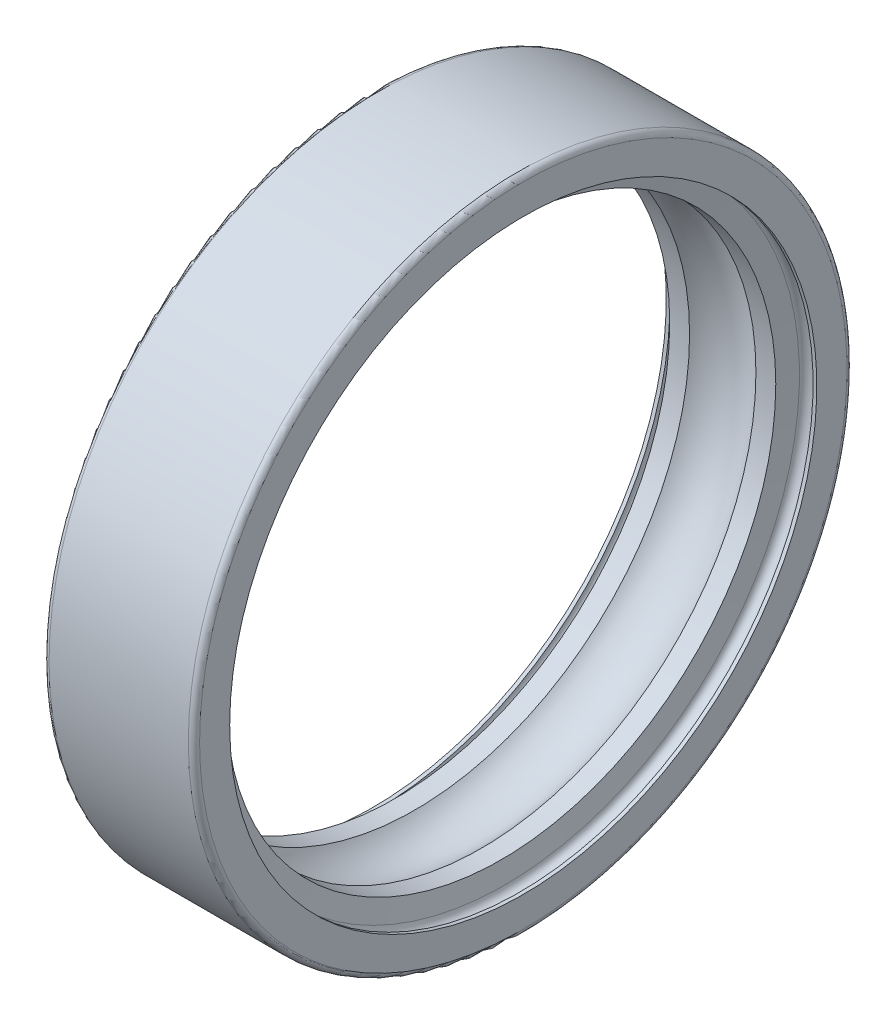
ISO-10303-21;
HEADER;
FILE_DESCRIPTION(('STEP AP214'),'2;1');
FILE_NAME('part.step','',(''),(''),'','','');
FILE_SCHEMA(('AUTOMOTIVE_DESIGN { 1 0 10303 214 1 1 1 1 }'));
ENDSEC;
DATA;
#1=APPLICATION_CONTEXT('core data for automotive mechanical design processes');
#2=APPLICATION_PROTOCOL_DEFINITION('international standard','automotive_design',2000,#1);
#3=PRODUCT_CONTEXT('',#1,'mechanical');
#4=PRODUCT('Part','Part','',(#3));
#5=PRODUCT_RELATED_PRODUCT_CATEGORY('part','',(#4));
#6=PRODUCT_DEFINITION_FORMATION('','',#4);
#7=PRODUCT_DEFINITION_CONTEXT('part definition',#1,'design');
#8=PRODUCT_DEFINITION('design','',#6,#7);
#9=PRODUCT_DEFINITION_SHAPE('','',#8);
#10=(LENGTH_UNIT() NAMED_UNIT(*) SI_UNIT(.MILLI.,.METRE.));
#11=(NAMED_UNIT(*) PLANE_ANGLE_UNIT() SI_UNIT($,.RADIAN.));
#12=(NAMED_UNIT(*) SI_UNIT($,.STERADIAN.) SOLID_ANGLE_UNIT());
#13=UNCERTAINTY_MEASURE_WITH_UNIT(LENGTH_MEASURE(1.E-05),#10,'distance_accuracy_value','');
#14=(GEOMETRIC_REPRESENTATION_CONTEXT(3) GLOBAL_UNCERTAINTY_ASSIGNED_CONTEXT((#13)) GLOBAL_UNIT_ASSIGNED_CONTEXT((#10,
#11,#12)) REPRESENTATION_CONTEXT('',''));
#15=CARTESIAN_POINT('',(0.,0.,0.));
#16=DIRECTION('',(0.,0.,1.));
#17=DIRECTION('',(1.,0.,0.));
#18=AXIS2_PLACEMENT_3D('',#15,#16,#17);
#19=CARTESIAN_POINT('',(6.81750237453724,0.,0.));
#20=DIRECTION('',(1.,0.,0.));
#21=DIRECTION('',(0.,0.,-1.));
#22=AXIS2_PLACEMENT_3D('',#19,#20,#21);
#23=CONICAL_SURFACE('',#22,14.6,1.39626340159546);
#24=CARTESIAN_POINT('',(7.00607689879512,0.,0.));
#25=DIRECTION('',(-1.,0.,0.));
#26=DIRECTION('',(0.,0.,1.));
#27=AXIS2_PLACEMENT_3D('',#24,#25,#26);
#28=CIRCLE('',#27,15.6694592710668);
#29=CARTESIAN_POINT('',(7.00607689879512,0.,15.6694592710668));
#30=VERTEX_POINT('',#29);
#31=EDGE_CURVE('E10',#30,#30,#28,.T.);
#32=ORIENTED_EDGE('',*,*,#31,.F.);
#33=EDGE_LOOP('',(#32));
#34=FACE_BOUND('',#33,.T.);
#35=CARTESIAN_POINT('',(6.81750237453724,0.,0.));
#36=DIRECTION('',(-1.,0.,0.));
#37=DIRECTION('',(0.,0.,1.));
#38=AXIS2_PLACEMENT_3D('',#35,#36,#37);
#39=CIRCLE('',#38,14.6);
#40=CARTESIAN_POINT('',(6.81750237453724,0.,14.6));
#41=VERTEX_POINT('',#40);
#42=EDGE_CURVE('E80',#41,#41,#39,.T.);
#43=ORIENTED_EDGE('',*,*,#42,.T.);
#44=EDGE_LOOP('',(#43));
#45=FACE_BOUND('',#44,.T.);
#46=ADVANCED_FACE('F14',(#34,#45),#23,.F.);
#47=CARTESIAN_POINT('',(7.4,0.,0.));
#48=DIRECTION('',(-1.,0.,0.));
#49=DIRECTION('',(0.,0.,1.));
#50=AXIS2_PLACEMENT_3D('',#47,#48,#49);
#51=TOROIDAL_SURFACE('',#50,15.6,0.4);
#52=ORIENTED_EDGE('',*,*,#31,.T.);
#53=EDGE_LOOP('',(#52));
#54=FACE_BOUND('',#53,.T.);
#55=CARTESIAN_POINT('',(7.8,0.,0.));
#56=DIRECTION('',(-1.,0.,0.));
#57=DIRECTION('',(0.,0.,1.));
#58=AXIS2_PLACEMENT_3D('',#55,#56,#57);
#59=CIRCLE('',#58,15.6);
#60=CARTESIAN_POINT('',(7.8,0.,15.6));
#61=VERTEX_POINT('',#60);
#62=EDGE_CURVE('E21',#61,#61,#59,.T.);
#63=ORIENTED_EDGE('',*,*,#62,.F.);
#64=EDGE_LOOP('',(#63));
#65=FACE_BOUND('',#64,.T.);
#66=ADVANCED_FACE('F105',(#54,#65),#51,.F.);
#67=CARTESIAN_POINT('',(0.,0.,0.));
#68=DIRECTION('',(-1.,0.,0.));
#69=DIRECTION('',(0.,0.,1.));
#70=AXIS2_PLACEMENT_3D('',#67,#68,#69);
#71=CYLINDRICAL_SURFACE('',#70,15.6);
#72=ORIENTED_EDGE('',*,*,#62,.T.);
#73=EDGE_LOOP('',(#72));
#74=FACE_BOUND('',#73,.T.);
#75=CARTESIAN_POINT('',(8.,0.,0.));
#76=DIRECTION('',(-1.,0.,0.));
#77=DIRECTION('',(0.,0.,1.));
#78=AXIS2_PLACEMENT_3D('',#75,#76,#77);
#79=CIRCLE('',#78,15.6);
#80=CARTESIAN_POINT('',(8.,0.,15.6));
#81=VERTEX_POINT('',#80);
#82=EDGE_CURVE('E30',#81,#81,#79,.T.);
#83=ORIENTED_EDGE('',*,*,#82,.F.);
#84=EDGE_LOOP('',(#83));
#85=FACE_BOUND('',#84,.T.);
#86=ADVANCED_FACE('F110',(#74,#85),#71,.F.);
#87=CARTESIAN_POINT('',(8.,15.6,0.));
#88=DIRECTION('',(-1.,0.,0.));
#89=DIRECTION('',(0.,0.,1.));
#90=AXIS2_PLACEMENT_3D('',#87,#88,#89);
#91=PLANE('',#90);
#92=CARTESIAN_POINT('',(8.,0.,0.));
#93=DIRECTION('',(-1.,0.,0.));
#94=DIRECTION('',(0.,0.,1.));
#95=AXIS2_PLACEMENT_3D('',#92,#93,#94);
#96=CIRCLE('',#95,17.2);
#97=CARTESIAN_POINT('',(8.,0.,17.2));
#98=VERTEX_POINT('',#97);
#99=EDGE_CURVE('E38',#98,#98,#96,.T.);
#100=ORIENTED_EDGE('',*,*,#99,.F.);
#101=EDGE_LOOP('',(#100));
#102=FACE_BOUND('',#101,.T.);
#103=ORIENTED_EDGE('',*,*,#82,.T.);
#104=EDGE_LOOP('',(#103));
#105=FACE_BOUND('',#104,.T.);
#106=ADVANCED_FACE('F114',(#102,#105),#91,.F.);
#107=CARTESIAN_POINT('',(7.7,0.,0.));
#108=DIRECTION('',(-1.,0.,0.));
#109=DIRECTION('',(0.,0.,1.));
#110=AXIS2_PLACEMENT_3D('',#107,#108,#109);
#111=TOROIDAL_SURFACE('',#110,17.2,0.3);
#112=CARTESIAN_POINT('',(7.7,0.,0.));
#113=DIRECTION('',(-1.,0.,0.));
#114=DIRECTION('',(0.,0.,1.));
#115=AXIS2_PLACEMENT_3D('',#112,#113,#114);
#116=CIRCLE('',#115,17.5);
#117=CARTESIAN_POINT('',(7.7,0.,17.5));
#118=VERTEX_POINT('',#117);
#119=EDGE_CURVE('E44',#118,#118,#116,.T.);
#120=ORIENTED_EDGE('',*,*,#119,.F.);
#121=EDGE_LOOP('',(#120));
#122=FACE_BOUND('',#121,.T.);
#123=ORIENTED_EDGE('',*,*,#99,.T.);
#124=EDGE_LOOP('',(#123));
#125=FACE_BOUND('',#124,.T.);
#126=ADVANCED_FACE('F120',(#122,#125),#111,.T.);
#127=CARTESIAN_POINT('',(0.,0.,0.));
#128=DIRECTION('',(-1.,0.,0.));
#129=DIRECTION('',(0.,0.,1.));
#130=AXIS2_PLACEMENT_3D('',#127,#128,#129);
#131=CYLINDRICAL_SURFACE('',#130,17.5);
#132=ORIENTED_EDGE('',*,*,#119,.T.);
#133=EDGE_LOOP('',(#132));
#134=FACE_BOUND('',#133,.T.);
#135=CARTESIAN_POINT('',(0.3,0.,0.));
#136=DIRECTION('',(-1.,0.,0.));
#137=DIRECTION('',(0.,0.,1.));
#138=AXIS2_PLACEMENT_3D('',#135,#136,#137);
#139=CIRCLE('',#138,17.5);
#140=CARTESIAN_POINT('',(0.3,0.,17.5));
#141=VERTEX_POINT('',#140);
#142=EDGE_CURVE('E48',#141,#141,#139,.T.);
#143=ORIENTED_EDGE('',*,*,#142,.F.);
#144=EDGE_LOOP('',(#143));
#145=FACE_BOUND('',#144,.T.);
#146=ADVANCED_FACE('F124',(#134,#145),#131,.T.);
#147=CARTESIAN_POINT('',(0.3,0.,0.));
#148=DIRECTION('',(-1.,0.,0.));
#149=DIRECTION('',(0.,0.,1.));
#150=AXIS2_PLACEMENT_3D('',#147,#148,#149);
#151=TOROIDAL_SURFACE('',#150,17.2,0.3);
#152=CARTESIAN_POINT('',(0.,0.,0.));
#153=DIRECTION('',(-1.,0.,0.));
#154=DIRECTION('',(0.,0.,1.));
#155=AXIS2_PLACEMENT_3D('',#152,#153,#154);
#156=CIRCLE('',#155,17.2);
#157=CARTESIAN_POINT('',(0.,0.,17.2));
#158=VERTEX_POINT('',#157);
#159=EDGE_CURVE('E52',#158,#158,#156,.T.);
#160=ORIENTED_EDGE('',*,*,#159,.F.);
#161=EDGE_LOOP('',(#160));
#162=FACE_BOUND('',#161,.T.);
#163=ORIENTED_EDGE('',*,*,#142,.T.);
#164=EDGE_LOOP('',(#163));
#165=FACE_BOUND('',#164,.T.);
#166=ADVANCED_FACE('F128',(#162,#165),#151,.T.);
#167=CARTESIAN_POINT('',(0.,15.6,0.));
#168=DIRECTION('',(-1.,0.,0.));
#169=DIRECTION('',(0.,0.,1.));
#170=AXIS2_PLACEMENT_3D('',#167,#168,#169);
#171=PLANE('',#170);
#172=ORIENTED_EDGE('',*,*,#159,.T.);
#173=EDGE_LOOP('',(#172));
#174=FACE_BOUND('',#173,.T.);
#175=CARTESIAN_POINT('',(0.,0.,0.));
#176=DIRECTION('',(-1.,0.,0.));
#177=DIRECTION('',(0.,0.,1.));
#178=AXIS2_PLACEMENT_3D('',#175,#176,#177);
#179=CIRCLE('',#178,15.6);
#180=CARTESIAN_POINT('',(0.,0.,15.6));
#181=VERTEX_POINT('',#180);
#182=EDGE_CURVE('E56',#181,#181,#179,.T.);
#183=ORIENTED_EDGE('',*,*,#182,.F.);
#184=EDGE_LOOP('',(#183));
#185=FACE_BOUND('',#184,.T.);
#186=ADVANCED_FACE('F132',(#174,#185),#171,.T.);
#187=CARTESIAN_POINT('',(0.,0.,0.));
#188=DIRECTION('',(-1.,0.,0.));
#189=DIRECTION('',(0.,0.,1.));
#190=AXIS2_PLACEMENT_3D('',#187,#188,#189);
#191=CYLINDRICAL_SURFACE('',#190,15.6);
#192=CARTESIAN_POINT('',(0.2,0.,0.));
#193=DIRECTION('',(-1.,0.,0.));
#194=DIRECTION('',(0.,0.,1.));
#195=AXIS2_PLACEMENT_3D('',#192,#193,#194);
#196=CIRCLE('',#195,15.6);
#197=CARTESIAN_POINT('',(0.2,0.,15.6));
#198=VERTEX_POINT('',#197);
#199=EDGE_CURVE('E60',#198,#198,#196,.T.);
#200=ORIENTED_EDGE('',*,*,#199,.F.);
#201=EDGE_LOOP('',(#200));
#202=FACE_BOUND('',#201,.T.);
#203=ORIENTED_EDGE('',*,*,#182,.T.);
#204=EDGE_LOOP('',(#203));
#205=FACE_BOUND('',#204,.T.);
#206=ADVANCED_FACE('F136',(#202,#205),#191,.F.);
#207=CARTESIAN_POINT('',(0.6,0.,0.));
#208=DIRECTION('',(-1.,0.,0.));
#209=DIRECTION('',(0.,0.,1.));
#210=AXIS2_PLACEMENT_3D('',#207,#208,#209);
#211=TOROIDAL_SURFACE('',#210,15.6,0.4);
#212=ORIENTED_EDGE('',*,*,#199,.T.);
#213=EDGE_LOOP('',(#212));
#214=FACE_BOUND('',#213,.T.);
#215=CARTESIAN_POINT('',(0.993923101204883,0.,0.));
#216=DIRECTION('',(-1.,0.,0.));
#217=DIRECTION('',(0.,0.,1.));
#218=AXIS2_PLACEMENT_3D('',#215,#216,#217);
#219=CIRCLE('',#218,15.6694592710668);
#220=CARTESIAN_POINT('',(0.993923101204883,0.,15.6694592710668));
#221=VERTEX_POINT('',#220);
#222=EDGE_CURVE('E64',#221,#221,#219,.T.);
#223=ORIENTED_EDGE('',*,*,#222,.F.);
#224=EDGE_LOOP('',(#223));
#225=FACE_BOUND('',#224,.T.);
#226=ADVANCED_FACE('F140',(#214,#225),#211,.F.);
#227=CARTESIAN_POINT('',(1.18249762546276,0.,0.));
#228=DIRECTION('',(-1.,0.,0.));
#229=DIRECTION('',(0.,0.,1.));
#230=AXIS2_PLACEMENT_3D('',#227,#228,#229);
#231=CONICAL_SURFACE('',#230,14.6,1.39626340159546);
#232=ORIENTED_EDGE('',*,*,#222,.T.);
#233=EDGE_LOOP('',(#232));
#234=FACE_BOUND('',#233,.T.);
#235=CARTESIAN_POINT('',(1.18249762546276,0.,0.));
#236=DIRECTION('',(-1.,0.,0.));
#237=DIRECTION('',(0.,0.,1.));
#238=AXIS2_PLACEMENT_3D('',#235,#236,#237);
#239=CIRCLE('',#238,14.6);
#240=CARTESIAN_POINT('',(1.18249762546276,0.,14.6));
#241=VERTEX_POINT('',#240);
#242=EDGE_CURVE('E68',#241,#241,#239,.T.);
#243=ORIENTED_EDGE('',*,*,#242,.F.);
#244=EDGE_LOOP('',(#243));
#245=FACE_BOUND('',#244,.T.);
#246=ADVANCED_FACE('F101',(#234,#245),#231,.F.);
#247=CARTESIAN_POINT('',(0.,0.,0.));
#248=DIRECTION('',(-1.,0.,0.));
#249=DIRECTION('',(0.,0.,1.));
#250=AXIS2_PLACEMENT_3D('',#247,#248,#249);
#251=CYLINDRICAL_SURFACE('',#250,14.6);
#252=CARTESIAN_POINT('',(2.23671868381702,0.,0.));
#253=DIRECTION('',(-1.,0.,0.));
#254=DIRECTION('',(0.,0.,1.));
#255=AXIS2_PLACEMENT_3D('',#252,#253,#254);
#256=CIRCLE('',#255,14.6);
#257=CARTESIAN_POINT('',(2.23671868381702,0.,14.6));
#258=VERTEX_POINT('',#257);
#259=EDGE_CURVE('E72',#258,#258,#256,.T.);
#260=ORIENTED_EDGE('',*,*,#259,.F.);
#261=EDGE_LOOP('',(#260));
#262=FACE_BOUND('',#261,.T.);
#263=ORIENTED_EDGE('',*,*,#242,.T.);
#264=EDGE_LOOP('',(#263));
#265=FACE_BOUND('',#264,.T.);
#266=ADVANCED_FACE('F94',(#262,#265),#251,.F.);
#267=CARTESIAN_POINT('',(4.,0.,0.));
#268=DIRECTION('',(-1.,0.,0.));
#269=DIRECTION('',(0.,0.,1.));
#270=AXIS2_PLACEMENT_3D('',#267,#268,#269);
#271=TOROIDAL_SURFACE('',#270,13.,2.381);
#272=ORIENTED_EDGE('',*,*,#259,.T.);
#273=EDGE_LOOP('',(#272));
#274=FACE_BOUND('',#273,.T.);
#275=CARTESIAN_POINT('',(5.76328131618298,0.,0.));
#276=DIRECTION('',(-1.,0.,0.));
#277=DIRECTION('',(0.,0.,1.));
#278=AXIS2_PLACEMENT_3D('',#275,#276,#277);
#279=CIRCLE('',#278,14.6);
#280=CARTESIAN_POINT('',(5.76328131618298,0.,14.6));
#281=VERTEX_POINT('',#280);
#282=EDGE_CURVE('E76',#281,#281,#279,.T.);
#283=ORIENTED_EDGE('',*,*,#282,.F.);
#284=EDGE_LOOP('',(#283));
#285=FACE_BOUND('',#284,.T.);
#286=ADVANCED_FACE('F89',(#274,#285),#271,.F.);
#287=CARTESIAN_POINT('',(0.,0.,0.));
#288=DIRECTION('',(-1.,0.,0.));
#289=DIRECTION('',(0.,0.,1.));
#290=AXIS2_PLACEMENT_3D('',#287,#288,#289);
#291=CYLINDRICAL_SURFACE('',#290,14.6);
#292=ORIENTED_EDGE('',*,*,#42,.F.);
#293=EDGE_LOOP('',(#292));
#294=FACE_BOUND('',#293,.T.);
#295=ORIENTED_EDGE('',*,*,#282,.T.);
#296=EDGE_LOOP('',(#295));
#297=FACE_BOUND('',#296,.T.);
#298=ADVANCED_FACE('F86',(#294,#297),#291,.F.);
#299=CLOSED_SHELL('',(#46,#66,#86,#106,#126,#146,#166,#186,#206,#226,#246,#266,#286,#298));
#300=MANIFOLD_SOLID_BREP('B1',#299);
#301=ADVANCED_BREP_SHAPE_REPRESENTATION('',(#18,#300),#14);
#302=SHAPE_DEFINITION_REPRESENTATION(#9,#301);
ENDSEC;
END-ISO-10303-21;
